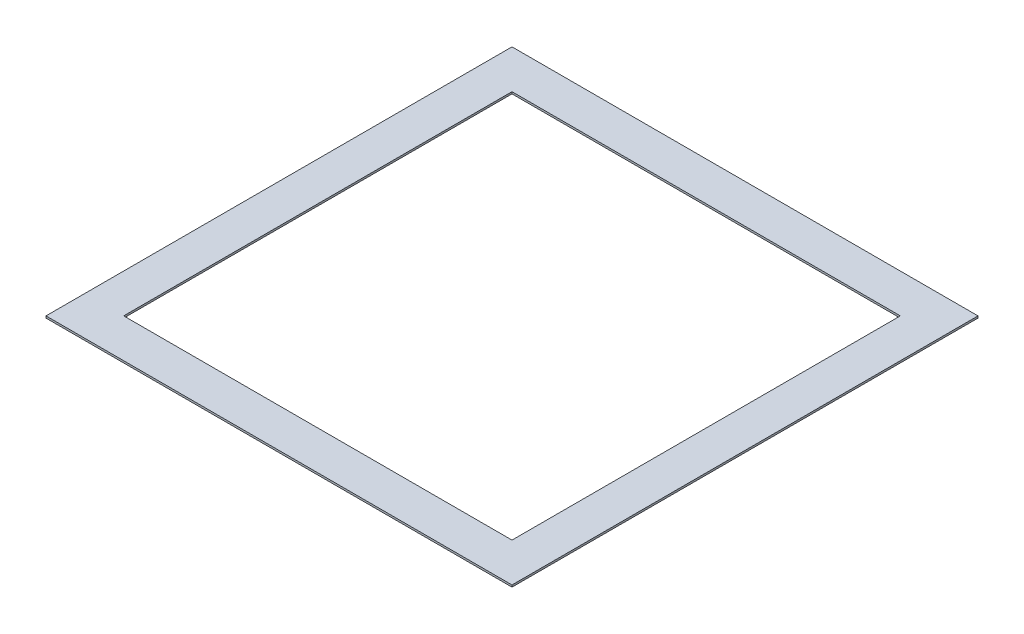
ISO-10303-21;
HEADER;
FILE_DESCRIPTION(('STEP AP214'),'2;1');
FILE_NAME('part.step','',(''),(''),'','','');
FILE_SCHEMA(('AUTOMOTIVE_DESIGN { 1 0 10303 214 1 1 1 1 }'));
ENDSEC;
DATA;
#1=APPLICATION_CONTEXT('core data for automotive mechanical design processes');
#2=APPLICATION_PROTOCOL_DEFINITION('international standard','automotive_design',2000,#1);
#3=PRODUCT_CONTEXT('',#1,'mechanical');
#4=PRODUCT('Part','Part','',(#3));
#5=PRODUCT_RELATED_PRODUCT_CATEGORY('part','',(#4));
#6=PRODUCT_DEFINITION_FORMATION('','',#4);
#7=PRODUCT_DEFINITION_CONTEXT('part definition',#1,'design');
#8=PRODUCT_DEFINITION('design','',#6,#7);
#9=PRODUCT_DEFINITION_SHAPE('','',#8);
#10=(LENGTH_UNIT() NAMED_UNIT(*) SI_UNIT(.MILLI.,.METRE.));
#11=(NAMED_UNIT(*) PLANE_ANGLE_UNIT() SI_UNIT($,.RADIAN.));
#12=(NAMED_UNIT(*) SI_UNIT($,.STERADIAN.) SOLID_ANGLE_UNIT());
#13=UNCERTAINTY_MEASURE_WITH_UNIT(LENGTH_MEASURE(1.E-05),#10,'distance_accuracy_value','');
#14=(GEOMETRIC_REPRESENTATION_CONTEXT(3) GLOBAL_UNCERTAINTY_ASSIGNED_CONTEXT((#13)) GLOBAL_UNIT_ASSIGNED_CONTEXT((#10,
#11,#12)) REPRESENTATION_CONTEXT('',''));
#15=CARTESIAN_POINT('',(0.,0.,0.));
#16=DIRECTION('',(0.,0.,1.));
#17=DIRECTION('',(1.,0.,0.));
#18=AXIS2_PLACEMENT_3D('',#15,#16,#17);
#19=CARTESIAN_POINT('',(0.,0.,0.));
#20=DIRECTION('',(0.,-1.,0.));
#21=DIRECTION('',(0.,0.,-1.));
#22=AXIS2_PLACEMENT_3D('',#19,#20,#21);
#23=PLANE('',#22);
#24=DIRECTION('',(0.,0.,1.));
#25=VECTOR('',#24,1.);
#26=CARTESIAN_POINT('',(304.8,0.,304.8));
#27=LINE('',#26,#25);
#28=CARTESIAN_POINT('',(304.8,0.,-304.8));
#29=VERTEX_POINT('',#28);
#30=CARTESIAN_POINT('',(304.8,0.,304.8));
#31=VERTEX_POINT('',#30);
#32=EDGE_CURVE('E113',#29,#31,#27,.T.);
#33=ORIENTED_EDGE('',*,*,#32,.T.);
#34=DIRECTION('',(-1.,0.,0.));
#35=VECTOR('',#34,1.);
#36=CARTESIAN_POINT('',(-304.8,0.,304.8));
#37=LINE('',#36,#35);
#38=CARTESIAN_POINT('',(-304.8,0.,304.8));
#39=VERTEX_POINT('',#38);
#40=EDGE_CURVE('E118',#31,#39,#37,.T.);
#41=ORIENTED_EDGE('',*,*,#40,.T.);
#42=DIRECTION('',(0.,0.,1.));
#43=VECTOR('',#42,1.);
#44=CARTESIAN_POINT('',(-304.8,0.,304.8));
#45=LINE('',#44,#43);
#46=CARTESIAN_POINT('',(-304.8,0.,-304.8));
#47=VERTEX_POINT('',#46);
#48=EDGE_CURVE('E121',#47,#39,#45,.T.);
#49=ORIENTED_EDGE('',*,*,#48,.F.);
#50=DIRECTION('',(-1.,0.,0.));
#51=VECTOR('',#50,1.);
#52=CARTESIAN_POINT('',(-304.8,0.,-304.8));
#53=LINE('',#52,#51);
#54=EDGE_CURVE('E108',#29,#47,#53,.T.);
#55=ORIENTED_EDGE('',*,*,#54,.F.);
#56=EDGE_LOOP('',(#33,#41,#49,#55));
#57=FACE_BOUND('',#56,.T.);
#58=DIRECTION('',(-1.,0.,0.));
#59=VECTOR('',#58,1.);
#60=CARTESIAN_POINT('',(-254.,0.,254.));
#61=LINE('',#60,#59);
#62=CARTESIAN_POINT('',(254.,0.,254.));
#63=VERTEX_POINT('',#62);
#64=CARTESIAN_POINT('',(-254.,0.,254.));
#65=VERTEX_POINT('',#64);
#66=EDGE_CURVE('E20',#63,#65,#61,.T.);
#67=ORIENTED_EDGE('',*,*,#66,.F.);
#68=DIRECTION('',(0.,0.,1.));
#69=VECTOR('',#68,1.);
#70=CARTESIAN_POINT('',(254.,0.,254.));
#71=LINE('',#70,#69);
#72=CARTESIAN_POINT('',(254.,0.,-254.));
#73=VERTEX_POINT('',#72);
#74=EDGE_CURVE('E78',#73,#63,#71,.T.);
#75=ORIENTED_EDGE('',*,*,#74,.F.);
#76=DIRECTION('',(-1.,0.,0.));
#77=VECTOR('',#76,1.);
#78=CARTESIAN_POINT('',(-254.,0.,-254.));
#79=LINE('',#78,#77);
#80=CARTESIAN_POINT('',(-254.,0.,-254.));
#81=VERTEX_POINT('',#80);
#82=EDGE_CURVE('E98',#73,#81,#79,.T.);
#83=ORIENTED_EDGE('',*,*,#82,.T.);
#84=DIRECTION('',(0.,0.,1.));
#85=VECTOR('',#84,1.);
#86=CARTESIAN_POINT('',(-254.,0.,254.));
#87=LINE('',#86,#85);
#88=EDGE_CURVE('E90',#81,#65,#87,.T.);
#89=ORIENTED_EDGE('',*,*,#88,.T.);
#90=EDGE_LOOP('',(#67,#75,#83,#89));
#91=FACE_BOUND('',#90,.T.);
#92=ADVANCED_FACE('F17',(#57,#91),#23,.T.);
#93=CARTESIAN_POINT('',(-254.,2.54,254.));
#94=DIRECTION('',(0.,0.,-1.));
#95=DIRECTION('',(-1.,0.,0.));
#96=AXIS2_PLACEMENT_3D('',#93,#94,#95);
#97=PLANE('',#96);
#98=DIRECTION('',(1.,0.,0.));
#99=VECTOR('',#98,1.);
#100=CARTESIAN_POINT('',(0.,2.54,254.));
#101=LINE('',#100,#99);
#102=CARTESIAN_POINT('',(-254.,2.54,254.));
#103=VERTEX_POINT('',#102);
#104=CARTESIAN_POINT('',(254.,2.54,254.));
#105=VERTEX_POINT('',#104);
#106=EDGE_CURVE('E96',#103,#105,#101,.T.);
#107=ORIENTED_EDGE('',*,*,#106,.T.);
#108=DIRECTION('',(0.,1.,0.));
#109=VECTOR('',#108,1.);
#110=CARTESIAN_POINT('',(254.,2.54,254.));
#111=LINE('',#110,#109);
#112=EDGE_CURVE('E85',#63,#105,#111,.T.);
#113=ORIENTED_EDGE('',*,*,#112,.F.);
#114=ORIENTED_EDGE('',*,*,#66,.T.);
#115=DIRECTION('',(0.,1.,0.));
#116=VECTOR('',#115,1.);
#117=CARTESIAN_POINT('',(-254.,2.54,254.));
#118=LINE('',#117,#116);
#119=EDGE_CURVE('E102',#65,#103,#118,.T.);
#120=ORIENTED_EDGE('',*,*,#119,.T.);
#121=EDGE_LOOP('',(#107,#113,#114,#120));
#122=FACE_BOUND('',#121,.T.);
#123=ADVANCED_FACE('F95',(#122),#97,.T.);
#124=CARTESIAN_POINT('',(254.,2.54,254.));
#125=DIRECTION('',(-1.,0.,0.));
#126=DIRECTION('',(0.,0.,1.));
#127=AXIS2_PLACEMENT_3D('',#124,#125,#126);
#128=PLANE('',#127);
#129=DIRECTION('',(0.,0.,-1.));
#130=VECTOR('',#129,1.);
#131=CARTESIAN_POINT('',(254.,2.54,0.));
#132=LINE('',#131,#130);
#133=CARTESIAN_POINT('',(254.,2.54,-254.));
#134=VERTEX_POINT('',#133);
#135=EDGE_CURVE('E128',#105,#134,#132,.T.);
#136=ORIENTED_EDGE('',*,*,#135,.T.);
#137=DIRECTION('',(0.,1.,0.));
#138=VECTOR('',#137,1.);
#139=CARTESIAN_POINT('',(254.,2.54,-254.));
#140=LINE('',#139,#138);
#141=EDGE_CURVE('E87',#134,#73,#140,.F.);
#142=ORIENTED_EDGE('',*,*,#141,.T.);
#143=ORIENTED_EDGE('',*,*,#74,.T.);
#144=ORIENTED_EDGE('',*,*,#112,.T.);
#145=EDGE_LOOP('',(#136,#142,#143,#144));
#146=FACE_BOUND('',#145,.T.);
#147=ADVANCED_FACE('F83',(#146),#128,.T.);
#148=CARTESIAN_POINT('',(-254.,2.54,-254.));
#149=DIRECTION('',(0.,0.,-1.));
#150=DIRECTION('',(-1.,0.,0.));
#151=AXIS2_PLACEMENT_3D('',#148,#149,#150);
#152=PLANE('',#151);
#153=ORIENTED_EDGE('',*,*,#141,.F.);
#154=DIRECTION('',(1.,0.,0.));
#155=VECTOR('',#154,1.);
#156=CARTESIAN_POINT('',(0.,2.54,-254.));
#157=LINE('',#156,#155);
#158=CARTESIAN_POINT('',(-254.,2.54,-254.));
#159=VERTEX_POINT('',#158);
#160=EDGE_CURVE('E130',#134,#159,#157,.F.);
#161=ORIENTED_EDGE('',*,*,#160,.T.);
#162=DIRECTION('',(0.,1.,0.));
#163=VECTOR('',#162,1.);
#164=CARTESIAN_POINT('',(-254.,2.54,-254.));
#165=LINE('',#164,#163);
#166=EDGE_CURVE('E104',#159,#81,#165,.F.);
#167=ORIENTED_EDGE('',*,*,#166,.T.);
#168=ORIENTED_EDGE('',*,*,#82,.F.);
#169=EDGE_LOOP('',(#153,#161,#167,#168));
#170=FACE_BOUND('',#169,.T.);
#171=ADVANCED_FACE('F176',(#170),#152,.F.);
#172=CARTESIAN_POINT('',(-254.,2.54,254.));
#173=DIRECTION('',(-1.,0.,0.));
#174=DIRECTION('',(0.,0.,1.));
#175=AXIS2_PLACEMENT_3D('',#172,#173,#174);
#176=PLANE('',#175);
#177=ORIENTED_EDGE('',*,*,#166,.F.);
#178=DIRECTION('',(0.,0.,-1.));
#179=VECTOR('',#178,1.);
#180=CARTESIAN_POINT('',(-254.,2.54,0.));
#181=LINE('',#180,#179);
#182=EDGE_CURVE('E133',#159,#103,#181,.F.);
#183=ORIENTED_EDGE('',*,*,#182,.T.);
#184=ORIENTED_EDGE('',*,*,#119,.F.);
#185=ORIENTED_EDGE('',*,*,#88,.F.);
#186=EDGE_LOOP('',(#177,#183,#184,#185));
#187=FACE_BOUND('',#186,.T.);
#188=ADVANCED_FACE('F173',(#187),#176,.F.);
#189=CARTESIAN_POINT('',(-304.8,2.54,-304.8));
#190=DIRECTION('',(0.,0.,-1.));
#191=DIRECTION('',(-1.,0.,0.));
#192=AXIS2_PLACEMENT_3D('',#189,#190,#191);
#193=PLANE('',#192);
#194=DIRECTION('',(1.,0.,0.));
#195=VECTOR('',#194,1.);
#196=CARTESIAN_POINT('',(0.,2.54,-304.8));
#197=LINE('',#196,#195);
#198=CARTESIAN_POINT('',(-304.8,2.54,-304.8));
#199=VERTEX_POINT('',#198);
#200=CARTESIAN_POINT('',(304.8,2.54,-304.8));
#201=VERTEX_POINT('',#200);
#202=EDGE_CURVE('E136',#199,#201,#197,.T.);
#203=ORIENTED_EDGE('',*,*,#202,.T.);
#204=DIRECTION('',(0.,1.,0.));
#205=VECTOR('',#204,1.);
#206=CARTESIAN_POINT('',(304.8,2.54,-304.8));
#207=LINE('',#206,#205);
#208=EDGE_CURVE('E110',#201,#29,#207,.F.);
#209=ORIENTED_EDGE('',*,*,#208,.T.);
#210=ORIENTED_EDGE('',*,*,#54,.T.);
#211=DIRECTION('',(0.,1.,0.));
#212=VECTOR('',#211,1.);
#213=CARTESIAN_POINT('',(-304.8,2.54,-304.8));
#214=LINE('',#213,#212);
#215=EDGE_CURVE('E124',#199,#47,#214,.F.);
#216=ORIENTED_EDGE('',*,*,#215,.F.);
#217=EDGE_LOOP('',(#203,#209,#210,#216));
#218=FACE_BOUND('',#217,.T.);
#219=ADVANCED_FACE('F155',(#218),#193,.T.);
#220=CARTESIAN_POINT('',(304.8,2.54,304.8));
#221=DIRECTION('',(-1.,0.,0.));
#222=DIRECTION('',(0.,0.,1.));
#223=AXIS2_PLACEMENT_3D('',#220,#221,#222);
#224=PLANE('',#223);
#225=ORIENTED_EDGE('',*,*,#208,.F.);
#226=DIRECTION('',(0.,0.,-1.));
#227=VECTOR('',#226,1.);
#228=CARTESIAN_POINT('',(304.8,2.54,0.));
#229=LINE('',#228,#227);
#230=CARTESIAN_POINT('',(304.8,2.54,304.8));
#231=VERTEX_POINT('',#230);
#232=EDGE_CURVE('E139',#201,#231,#229,.F.);
#233=ORIENTED_EDGE('',*,*,#232,.T.);
#234=DIRECTION('',(0.,1.,0.));
#235=VECTOR('',#234,1.);
#236=CARTESIAN_POINT('',(304.8,2.54,304.8));
#237=LINE('',#236,#235);
#238=EDGE_CURVE('E115',#231,#31,#237,.F.);
#239=ORIENTED_EDGE('',*,*,#238,.T.);
#240=ORIENTED_EDGE('',*,*,#32,.F.);
#241=EDGE_LOOP('',(#225,#233,#239,#240));
#242=FACE_BOUND('',#241,.T.);
#243=ADVANCED_FACE('F152',(#242),#224,.F.);
#244=CARTESIAN_POINT('',(-304.8,2.54,304.8));
#245=DIRECTION('',(0.,0.,-1.));
#246=DIRECTION('',(-1.,0.,0.));
#247=AXIS2_PLACEMENT_3D('',#244,#245,#246);
#248=PLANE('',#247);
#249=ORIENTED_EDGE('',*,*,#238,.F.);
#250=DIRECTION('',(1.,0.,0.));
#251=VECTOR('',#250,1.);
#252=CARTESIAN_POINT('',(0.,2.54,304.8));
#253=LINE('',#252,#251);
#254=CARTESIAN_POINT('',(-304.8,2.54,304.8));
#255=VERTEX_POINT('',#254);
#256=EDGE_CURVE('E26',#231,#255,#253,.F.);
#257=ORIENTED_EDGE('',*,*,#256,.T.);
#258=DIRECTION('',(0.,1.,0.));
#259=VECTOR('',#258,1.);
#260=CARTESIAN_POINT('',(-304.8,2.54,304.8));
#261=LINE('',#260,#259);
#262=EDGE_CURVE('E34',#39,#255,#261,.T.);
#263=ORIENTED_EDGE('',*,*,#262,.F.);
#264=ORIENTED_EDGE('',*,*,#40,.F.);
#265=EDGE_LOOP('',(#249,#257,#263,#264));
#266=FACE_BOUND('',#265,.T.);
#267=ADVANCED_FACE('F145',(#266),#248,.F.);
#268=CARTESIAN_POINT('',(-304.8,2.54,304.8));
#269=DIRECTION('',(-1.,0.,0.));
#270=DIRECTION('',(0.,0.,1.));
#271=AXIS2_PLACEMENT_3D('',#268,#269,#270);
#272=PLANE('',#271);
#273=DIRECTION('',(0.,0.,-1.));
#274=VECTOR('',#273,1.);
#275=CARTESIAN_POINT('',(-304.8,2.54,0.));
#276=LINE('',#275,#274);
#277=EDGE_CURVE('E11',#255,#199,#276,.T.);
#278=ORIENTED_EDGE('',*,*,#277,.T.);
#279=ORIENTED_EDGE('',*,*,#215,.T.);
#280=ORIENTED_EDGE('',*,*,#48,.T.);
#281=ORIENTED_EDGE('',*,*,#262,.T.);
#282=EDGE_LOOP('',(#278,#279,#280,#281));
#283=FACE_BOUND('',#282,.T.);
#284=ADVANCED_FACE('F158',(#283),#272,.T.);
#285=CARTESIAN_POINT('',(0.,2.54,0.));
#286=DIRECTION('',(0.,-1.,0.));
#287=DIRECTION('',(0.,0.,-1.));
#288=AXIS2_PLACEMENT_3D('',#285,#286,#287);
#289=PLANE('',#288);
#290=ORIENTED_EDGE('',*,*,#256,.F.);
#291=ORIENTED_EDGE('',*,*,#232,.F.);
#292=ORIENTED_EDGE('',*,*,#202,.F.);
#293=ORIENTED_EDGE('',*,*,#277,.F.);
#294=EDGE_LOOP('',(#290,#291,#292,#293));
#295=FACE_BOUND('',#294,.T.);
#296=ORIENTED_EDGE('',*,*,#160,.F.);
#297=ORIENTED_EDGE('',*,*,#135,.F.);
#298=ORIENTED_EDGE('',*,*,#106,.F.);
#299=ORIENTED_EDGE('',*,*,#182,.F.);
#300=EDGE_LOOP('',(#296,#297,#298,#299));
#301=FACE_BOUND('',#300,.T.);
#302=ADVANCED_FACE('F149',(#295,#301),#289,.F.);
#303=CLOSED_SHELL('',(#92,#123,#147,#171,#188,#219,#243,#267,#284,#302));
#304=MANIFOLD_SOLID_BREP('B1',#303);
#305=ADVANCED_BREP_SHAPE_REPRESENTATION('',(#18,#304),#14);
#306=SHAPE_DEFINITION_REPRESENTATION(#9,#305);
ENDSEC;
END-ISO-10303-21;
